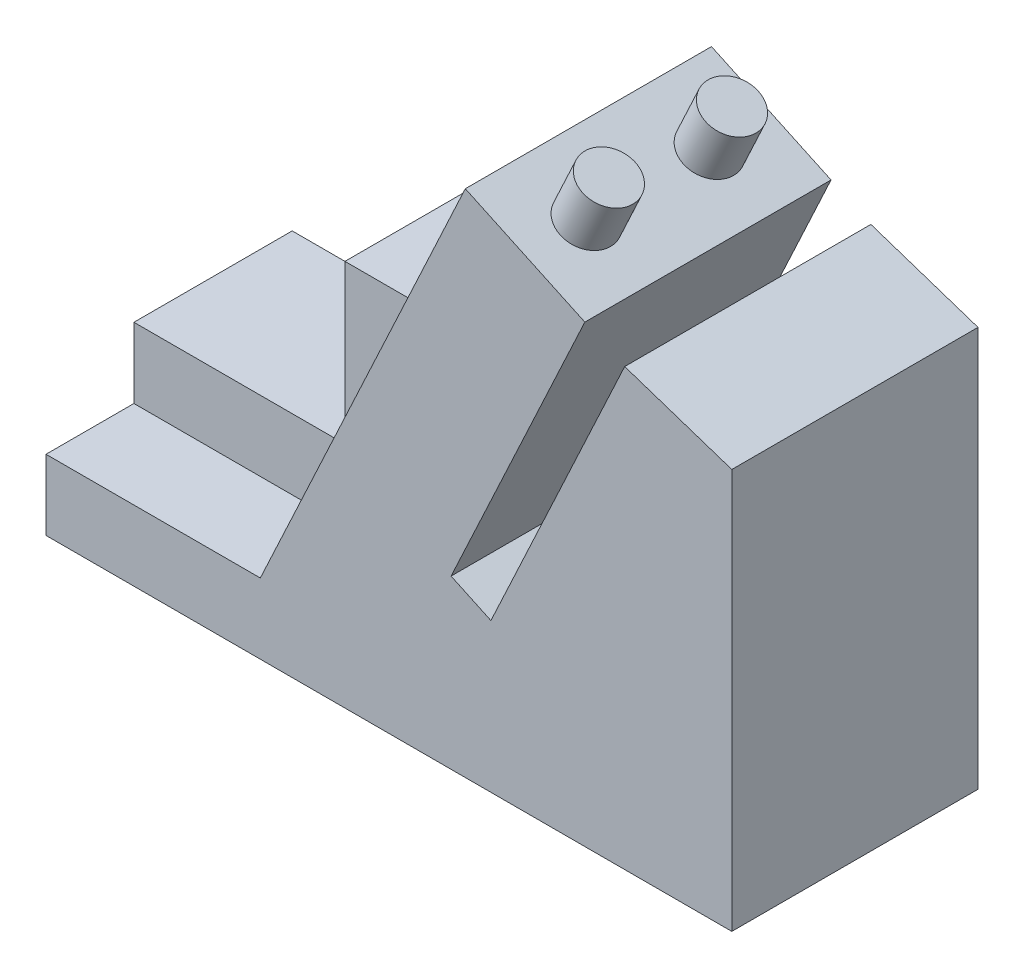
ISO-10303-21;
HEADER;
FILE_DESCRIPTION(('STEP AP214'),'2;1');
FILE_NAME('part.step','',(''),(''),'','','');
FILE_SCHEMA(('AUTOMOTIVE_DESIGN { 1 0 10303 214 1 1 1 1 }'));
ENDSEC;
DATA;
#1=APPLICATION_CONTEXT('core data for automotive mechanical design processes');
#2=APPLICATION_PROTOCOL_DEFINITION('international standard','automotive_design',2000,#1);
#3=PRODUCT_CONTEXT('',#1,'mechanical');
#4=PRODUCT('Part','Part','',(#3));
#5=PRODUCT_RELATED_PRODUCT_CATEGORY('part','',(#4));
#6=PRODUCT_DEFINITION_FORMATION('','',#4);
#7=PRODUCT_DEFINITION_CONTEXT('part definition',#1,'design');
#8=PRODUCT_DEFINITION('design','',#6,#7);
#9=PRODUCT_DEFINITION_SHAPE('','',#8);
#10=(LENGTH_UNIT() NAMED_UNIT(*) SI_UNIT(.MILLI.,.METRE.));
#11=(NAMED_UNIT(*) PLANE_ANGLE_UNIT() SI_UNIT($,.RADIAN.));
#12=(NAMED_UNIT(*) SI_UNIT($,.STERADIAN.) SOLID_ANGLE_UNIT());
#13=UNCERTAINTY_MEASURE_WITH_UNIT(LENGTH_MEASURE(1.E-05),#10,'distance_accuracy_value','');
#14=(GEOMETRIC_REPRESENTATION_CONTEXT(3) GLOBAL_UNCERTAINTY_ASSIGNED_CONTEXT((#13)) GLOBAL_UNIT_ASSIGNED_CONTEXT((#10,
#11,#12)) REPRESENTATION_CONTEXT('',''));
#15=CARTESIAN_POINT('',(0.,0.,0.));
#16=DIRECTION('',(0.,0.,1.));
#17=DIRECTION('',(1.,0.,0.));
#18=AXIS2_PLACEMENT_3D('',#15,#16,#17);
#19=CARTESIAN_POINT('',(0.,0.,28.));
#20=DIRECTION('',(-1.,0.,0.));
#21=DIRECTION('',(0.,0.,1.));
#22=AXIS2_PLACEMENT_3D('',#19,#20,#21);
#23=PLANE('',#22);
#24=DIRECTION('',(0.,1.,0.));
#25=VECTOR('',#24,1.);
#26=CARTESIAN_POINT('',(0.,0.,0.));
#27=LINE('',#26,#25);
#28=CARTESIAN_POINT('',(0.,0.,0.));
#29=VERTEX_POINT('',#28);
#30=CARTESIAN_POINT('',(0.,45.5,0.));
#31=VERTEX_POINT('',#30);
#32=EDGE_CURVE('E164',#29,#31,#27,.T.);
#33=ORIENTED_EDGE('',*,*,#32,.T.);
#34=DIRECTION('',(0.,0.,-1.));
#35=VECTOR('',#34,1.);
#36=CARTESIAN_POINT('',(0.,45.5,28.));
#37=LINE('',#36,#35);
#38=CARTESIAN_POINT('',(0.,45.5,28.));
#39=VERTEX_POINT('',#38);
#40=EDGE_CURVE('E11',#39,#31,#37,.T.);
#41=ORIENTED_EDGE('',*,*,#40,.F.);
#42=DIRECTION('',(0.,1.,0.));
#43=VECTOR('',#42,1.);
#44=CARTESIAN_POINT('',(0.,0.,28.));
#45=LINE('',#44,#43);
#46=CARTESIAN_POINT('',(0.,0.,28.));
#47=VERTEX_POINT('',#46);
#48=EDGE_CURVE('E199',#47,#39,#45,.T.);
#49=ORIENTED_EDGE('',*,*,#48,.F.);
#50=DIRECTION('',(0.,0.,-1.));
#51=VECTOR('',#50,1.);
#52=CARTESIAN_POINT('',(0.,0.,28.));
#53=LINE('',#52,#51);
#54=EDGE_CURVE('E65',#47,#29,#53,.T.);
#55=ORIENTED_EDGE('',*,*,#54,.T.);
#56=EDGE_LOOP('',(#33,#41,#49,#55));
#57=FACE_BOUND('',#56,.T.);
#58=ADVANCED_FACE('F41',(#57),#23,.F.);
#59=CARTESIAN_POINT('',(13.6139316460527,40.9769955049263,28.));
#60=DIRECTION('',(-0.315288268413878,-0.948995947199238,0.));
#61=DIRECTION('',(0.948995947199238,-0.315288268413878,0.));
#62=AXIS2_PLACEMENT_3D('',#59,#60,#61);
#63=PLANE('',#62);
#64=DIRECTION('',(-0.948995947199238,0.315288268413878,0.));
#65=VECTOR('',#64,1.);
#66=CARTESIAN_POINT('',(13.6139316460527,40.9769955049263,0.));
#67=LINE('',#66,#65);
#68=CARTESIAN_POINT('',(-12.1831015382463,49.5476347651859,0.));
#69=VERTEX_POINT('',#68);
#70=EDGE_CURVE('E167',#31,#69,#67,.T.);
#71=ORIENTED_EDGE('',*,*,#70,.T.);
#72=DIRECTION('',(0.,0.,-1.));
#73=VECTOR('',#72,1.);
#74=CARTESIAN_POINT('',(-12.1831015382463,49.5476347651859,28.));
#75=LINE('',#74,#73);
#76=CARTESIAN_POINT('',(-12.1831015382463,49.5476347651859,28.));
#77=VERTEX_POINT('',#76);
#78=EDGE_CURVE('E49',#77,#69,#75,.T.);
#79=ORIENTED_EDGE('',*,*,#78,.F.);
#80=DIRECTION('',(-0.948995947199238,0.315288268413878,0.));
#81=VECTOR('',#80,1.);
#82=CARTESIAN_POINT('',(13.6139316460527,40.9769955049263,28.));
#83=LINE('',#82,#81);
#84=EDGE_CURVE('E103',#39,#77,#83,.T.);
#85=ORIENTED_EDGE('',*,*,#84,.F.);
#86=ORIENTED_EDGE('',*,*,#40,.T.);
#87=EDGE_LOOP('',(#71,#79,#85,#86));
#88=FACE_BOUND('',#87,.T.);
#89=ADVANCED_FACE('F225',(#88),#63,.F.);
#90=CARTESIAN_POINT('',(-28.9849692680718,13.5159131410895,28.));
#91=DIRECTION('',(-0.906307787036647,0.422618261740707,0.));
#92=DIRECTION('',(-0.422618261740707,-0.906307787036647,0.));
#93=AXIS2_PLACEMENT_3D('',#90,#91,#92);
#94=PLANE('',#93);
#95=DIRECTION('',(0.422618261740706,0.906307787036647,0.));
#96=VECTOR('',#95,1.);
#97=CARTESIAN_POINT('',(-28.9849692680718,13.5159131410895,0.));
#98=LINE('',#97,#96);
#99=CARTESIAN_POINT('',(-27.3973589609117,16.9205544318666,0.));
#100=VERTEX_POINT('',#99);
#101=EDGE_CURVE('E172',#100,#69,#98,.T.);
#102=ORIENTED_EDGE('',*,*,#101,.F.);
#103=DIRECTION('',(0.,0.,-1.));
#104=VECTOR('',#103,1.);
#105=CARTESIAN_POINT('',(-27.3973589609117,16.9205544318666,28.));
#106=LINE('',#105,#104);
#107=CARTESIAN_POINT('',(-27.3973589609117,16.9205544318666,28.));
#108=VERTEX_POINT('',#107);
#109=EDGE_CURVE('E216',#108,#100,#106,.T.);
#110=ORIENTED_EDGE('',*,*,#109,.F.);
#111=DIRECTION('',(0.422618261740706,0.906307787036647,0.));
#112=VECTOR('',#111,1.);
#113=CARTESIAN_POINT('',(-28.9849692680718,13.5159131410895,28.));
#114=LINE('',#113,#112);
#115=EDGE_CURVE('E224',#108,#77,#114,.T.);
#116=ORIENTED_EDGE('',*,*,#115,.T.);
#117=ORIENTED_EDGE('',*,*,#78,.T.);
#118=EDGE_LOOP('',(#102,#110,#116,#117));
#119=FACE_BOUND('',#118,.T.);
#120=ADVANCED_FACE('F222',(#119),#94,.T.);
#121=CARTESIAN_POINT('',(1.58761030716014,3.40464129077717,28.));
#122=DIRECTION('',(0.422618261740705,0.906307787036647,0.));
#123=DIRECTION('',(-0.906307787036647,0.422618261740705,0.));
#124=AXIS2_PLACEMENT_3D('',#121,#122,#123);
#125=PLANE('',#124);
#126=DIRECTION('',(0.906307787036647,-0.422618261740705,0.));
#127=VECTOR('',#126,1.);
#128=CARTESIAN_POINT('',(1.58761030716014,3.40464129077717,0.));
#129=LINE('',#128,#127);
#130=CARTESIAN_POINT('',(-31.9288978960949,19.0336457405701,0.));
#131=VERTEX_POINT('',#130);
#132=EDGE_CURVE('E176',#131,#100,#129,.T.);
#133=ORIENTED_EDGE('',*,*,#132,.F.);
#134=DIRECTION('',(0.,0.,-1.));
#135=VECTOR('',#134,1.);
#136=CARTESIAN_POINT('',(-31.9288978960949,19.0336457405701,28.));
#137=LINE('',#136,#135);
#138=CARTESIAN_POINT('',(-31.9288978960949,19.0336457405701,28.));
#139=VERTEX_POINT('',#138);
#140=EDGE_CURVE('E213',#139,#131,#137,.T.);
#141=ORIENTED_EDGE('',*,*,#140,.F.);
#142=DIRECTION('',(0.906307787036647,-0.422618261740705,0.));
#143=VECTOR('',#142,1.);
#144=CARTESIAN_POINT('',(1.58761030716014,3.40464129077717,28.));
#145=LINE('',#144,#143);
#146=EDGE_CURVE('E234',#139,#108,#145,.T.);
#147=ORIENTED_EDGE('',*,*,#146,.T.);
#148=ORIENTED_EDGE('',*,*,#109,.T.);
#149=EDGE_LOOP('',(#133,#141,#147,#148));
#150=FACE_BOUND('',#149,.T.);
#151=ADVANCED_FACE('F231',(#150),#125,.T.);
#152=CARTESIAN_POINT('',(-33.5165082032551,15.629004449793,28.));
#153=DIRECTION('',(0.906307787036646,-0.422618261740707,0.));
#154=DIRECTION('',(0.422618261740707,0.906307787036646,0.));
#155=AXIS2_PLACEMENT_3D('',#152,#153,#154);
#156=PLANE('',#155);
#157=DIRECTION('',(-0.422618261740707,-0.906307787036646,0.));
#158=VECTOR('',#157,1.);
#159=CARTESIAN_POINT('',(-33.5165082032551,15.629004449793,0.));
#160=LINE('',#159,#158);
#161=CARTESIAN_POINT('',(-16.7146404734295,51.6607260738894,0.));
#162=VERTEX_POINT('',#161);
#163=EDGE_CURVE('E180',#162,#131,#160,.T.);
#164=ORIENTED_EDGE('',*,*,#163,.F.);
#165=DIRECTION('',(0.,0.,-1.));
#166=VECTOR('',#165,1.);
#167=CARTESIAN_POINT('',(-16.7146404734295,51.6607260738894,28.));
#168=LINE('',#167,#166);
#169=CARTESIAN_POINT('',(-16.7146404734295,51.6607260738894,28.));
#170=VERTEX_POINT('',#169);
#171=EDGE_CURVE('E210',#170,#162,#168,.T.);
#172=ORIENTED_EDGE('',*,*,#171,.F.);
#173=DIRECTION('',(-0.422618261740707,-0.906307787036646,0.));
#174=VECTOR('',#173,1.);
#175=CARTESIAN_POINT('',(-33.5165082032551,15.629004449793,28.));
#176=LINE('',#175,#174);
#177=EDGE_CURVE('E241',#170,#139,#176,.T.);
#178=ORIENTED_EDGE('',*,*,#177,.T.);
#179=ORIENTED_EDGE('',*,*,#140,.T.);
#180=EDGE_LOOP('',(#164,#172,#178,#179));
#181=FACE_BOUND('',#180,.T.);
#182=ADVANCED_FACE('F332',(#181),#156,.T.);
#183=CARTESIAN_POINT('',(16.8018677298256,36.0317216240964,28.));
#184=DIRECTION('',(0.422618261740707,0.906307787036646,0.));
#185=DIRECTION('',(-0.906307787036646,0.422618261740708,0.));
#186=AXIS2_PLACEMENT_3D('',#183,#184,#185);
#187=PLANE('',#186);
#188=CARTESIAN_POINT('',(-23.5119488762043,54.8303630369447,7.));
#189=DIRECTION('',(0.422618261740708,0.906307787036646,0.));
#190=DIRECTION('',(0.906307787036646,-0.422618261740708,0.));
#191=AXIS2_PLACEMENT_3D('',#188,#189,#190);
#192=CIRCLE('',#191,3.);
#193=CARTESIAN_POINT('',(-20.7930255150944,53.5625082517226,7.));
#194=VERTEX_POINT('',#193);
#195=EDGE_CURVE('E454',#194,#194,#192,.T.);
#196=ORIENTED_EDGE('',*,*,#195,.F.);
#197=EDGE_LOOP('',(#196));
#198=FACE_BOUND('',#197,.T.);
#199=CARTESIAN_POINT('',(-23.5119488762043,54.8303630369447,21.));
#200=DIRECTION('',(0.422618261740708,0.906307787036646,0.));
#201=DIRECTION('',(-0.906307787036646,0.422618261740708,0.));
#202=AXIS2_PLACEMENT_3D('',#199,#200,#201);
#203=CIRCLE('',#202,3.);
#204=CARTESIAN_POINT('',(-20.7930255150944,53.5625082517226,21.));
#205=VERTEX_POINT('',#204);
#206=EDGE_CURVE('E453',#205,#205,#203,.T.);
#207=ORIENTED_EDGE('',*,*,#206,.F.);
#208=EDGE_LOOP('',(#207));
#209=FACE_BOUND('',#208,.T.);
#210=DIRECTION('',(0.906307787036646,-0.422618261740707,0.));
#211=VECTOR('',#210,1.);
#212=CARTESIAN_POINT('',(16.8018677298256,36.0317216240964,0.));
#213=LINE('',#212,#211);
#214=CARTESIAN_POINT('',(-30.3092572789792,58.,0.));
#215=VERTEX_POINT('',#214);
#216=EDGE_CURVE('E184',#215,#162,#213,.T.);
#217=ORIENTED_EDGE('',*,*,#216,.F.);
#218=DIRECTION('',(0.,0.,-1.));
#219=VECTOR('',#218,1.);
#220=CARTESIAN_POINT('',(-30.3092572789792,58.,28.));
#221=LINE('',#220,#219);
#222=CARTESIAN_POINT('',(-30.3092572789792,58.,28.));
#223=VERTEX_POINT('',#222);
#224=EDGE_CURVE('E206',#223,#215,#221,.T.);
#225=ORIENTED_EDGE('',*,*,#224,.F.);
#226=DIRECTION('',(0.906307787036646,-0.422618261740707,0.));
#227=VECTOR('',#226,1.);
#228=CARTESIAN_POINT('',(16.8018677298256,36.0317216240964,28.));
#229=LINE('',#228,#227);
#230=EDGE_CURVE('E248',#223,#170,#229,.T.);
#231=ORIENTED_EDGE('',*,*,#230,.T.);
#232=ORIENTED_EDGE('',*,*,#171,.T.);
#233=EDGE_LOOP('',(#217,#225,#231,#232));
#234=FACE_BOUND('',#233,.T.);
#235=ADVANCED_FACE('F335',(#198,#209,#234),#187,.T.);
#236=CARTESIAN_POINT('',(-47.1111250088047,21.9682783759034,28.));
#237=DIRECTION('',(-0.906307787036648,0.422618261740704,0.));
#238=DIRECTION('',(-0.422618261740704,-0.906307787036648,0.));
#239=AXIS2_PLACEMENT_3D('',#236,#237,#238);
#240=PLANE('',#239);
#241=DIRECTION('',(0.,0.,-1.));
#242=VECTOR('',#241,1.);
#243=CARTESIAN_POINT('',(-41.5006410746993,34.,18.));
#244=LINE('',#243,#242);
#245=CARTESIAN_POINT('',(-41.5006410746993,34.,18.));
#246=VERTEX_POINT('',#245);
#247=CARTESIAN_POINT('',(-41.5006410746993,34.,0.));
#248=VERTEX_POINT('',#247);
#249=EDGE_CURVE('E168',#246,#248,#244,.T.);
#250=ORIENTED_EDGE('',*,*,#249,.F.);
#251=DIRECTION('',(0.422618261740704,0.906307787036648,0.));
#252=VECTOR('',#251,1.);
#253=CARTESIAN_POINT('',(-47.1111250088047,21.9682783759034,18.));
#254=LINE('',#253,#252);
#255=CARTESIAN_POINT('',(-53.6246401867294,7.99999999999999,18.));
#256=VERTEX_POINT('',#255);
#257=EDGE_CURVE('E260',#256,#246,#254,.T.);
#258=ORIENTED_EDGE('',*,*,#257,.F.);
#259=DIRECTION('',(0.,0.,-1.));
#260=VECTOR('',#259,1.);
#261=CARTESIAN_POINT('',(-53.6246401867294,7.99999999999999,28.));
#262=LINE('',#261,#260);
#263=CARTESIAN_POINT('',(-53.6246401867294,7.99999999999999,28.));
#264=VERTEX_POINT('',#263);
#265=EDGE_CURVE('E141',#264,#256,#262,.T.);
#266=ORIENTED_EDGE('',*,*,#265,.F.);
#267=DIRECTION('',(0.422618261740704,0.906307787036648,0.));
#268=VECTOR('',#267,1.);
#269=CARTESIAN_POINT('',(-47.1111250088047,21.9682783759034,28.));
#270=LINE('',#269,#268);
#271=EDGE_CURVE('E152',#264,#223,#270,.T.);
#272=ORIENTED_EDGE('',*,*,#271,.T.);
#273=ORIENTED_EDGE('',*,*,#224,.T.);
#274=DIRECTION('',(0.422618261740704,0.906307787036648,0.));
#275=VECTOR('',#274,1.);
#276=CARTESIAN_POINT('',(-47.1111250088047,21.9682783759034,0.));
#277=LINE('',#276,#275);
#278=EDGE_CURVE('E188',#248,#215,#277,.T.);
#279=ORIENTED_EDGE('',*,*,#278,.F.);
#280=EDGE_LOOP('',(#250,#258,#266,#272,#273,#279));
#281=FACE_BOUND('',#280,.T.);
#282=ADVANCED_FACE('F254',(#281),#240,.T.);
#283=CARTESIAN_POINT('',(0.,7.99999999999999,28.));
#284=DIRECTION('',(0.,1.,0.));
#285=DIRECTION('',(0.,0.,1.));
#286=AXIS2_PLACEMENT_3D('',#283,#284,#285);
#287=PLANE('',#286);
#288=DIRECTION('',(1.,0.,0.));
#289=VECTOR('',#288,1.);
#290=CARTESIAN_POINT('',(0.,7.99999999999999,18.));
#291=LINE('',#290,#289);
#292=CARTESIAN_POINT('',(-78.,7.99999999999999,18.));
#293=VERTEX_POINT('',#292);
#294=EDGE_CURVE('E136',#293,#256,#291,.T.);
#295=ORIENTED_EDGE('',*,*,#294,.F.);
#296=DIRECTION('',(0.,0.,-1.));
#297=VECTOR('',#296,1.);
#298=CARTESIAN_POINT('',(-78.,7.99999999999999,28.));
#299=LINE('',#298,#297);
#300=CARTESIAN_POINT('',(-78.,7.99999999999999,28.));
#301=VERTEX_POINT('',#300);
#302=EDGE_CURVE('E129',#301,#293,#299,.T.);
#303=ORIENTED_EDGE('',*,*,#302,.F.);
#304=DIRECTION('',(1.,0.,0.));
#305=VECTOR('',#304,1.);
#306=CARTESIAN_POINT('',(0.,7.99999999999999,28.));
#307=LINE('',#306,#305);
#308=EDGE_CURVE('E133',#301,#264,#307,.T.);
#309=ORIENTED_EDGE('',*,*,#308,.T.);
#310=ORIENTED_EDGE('',*,*,#265,.T.);
#311=EDGE_LOOP('',(#295,#303,#309,#310));
#312=FACE_BOUND('',#311,.T.);
#313=ADVANCED_FACE('F131',(#312),#287,.T.);
#314=CARTESIAN_POINT('',(-78.,0.,28.));
#315=DIRECTION('',(-1.,0.,0.));
#316=DIRECTION('',(0.,-1.,0.));
#317=AXIS2_PLACEMENT_3D('',#314,#315,#316);
#318=PLANE('',#317);
#319=DIRECTION('',(0.,1.,0.));
#320=VECTOR('',#319,1.);
#321=CARTESIAN_POINT('',(-78.,0.,0.));
#322=LINE('',#321,#320);
#323=CARTESIAN_POINT('',(-78.,0.,0.));
#324=VERTEX_POINT('',#323);
#325=CARTESIAN_POINT('',(-78.,16.,0.));
#326=VERTEX_POINT('',#325);
#327=EDGE_CURVE('E191',#324,#326,#322,.T.);
#328=ORIENTED_EDGE('',*,*,#327,.F.);
#329=DIRECTION('',(0.,0.,-1.));
#330=VECTOR('',#329,1.);
#331=CARTESIAN_POINT('',(-78.,0.,28.));
#332=LINE('',#331,#330);
#333=CARTESIAN_POINT('',(-78.,0.,28.));
#334=VERTEX_POINT('',#333);
#335=EDGE_CURVE('E142',#334,#324,#332,.T.);
#336=ORIENTED_EDGE('',*,*,#335,.F.);
#337=DIRECTION('',(0.,1.,0.));
#338=VECTOR('',#337,1.);
#339=CARTESIAN_POINT('',(-78.,0.,28.));
#340=LINE('',#339,#338);
#341=EDGE_CURVE('E149',#334,#301,#340,.T.);
#342=ORIENTED_EDGE('',*,*,#341,.T.);
#343=ORIENTED_EDGE('',*,*,#302,.T.);
#344=DIRECTION('',(0.,1.,0.));
#345=VECTOR('',#344,1.);
#346=CARTESIAN_POINT('',(-78.,0.,18.));
#347=LINE('',#346,#345);
#348=CARTESIAN_POINT('',(-78.,16.,18.));
#349=VERTEX_POINT('',#348);
#350=EDGE_CURVE('E289',#293,#349,#347,.T.);
#351=ORIENTED_EDGE('',*,*,#350,.T.);
#352=DIRECTION('',(0.,0.,-1.));
#353=VECTOR('',#352,1.);
#354=CARTESIAN_POINT('',(-78.,16.,18.));
#355=LINE('',#354,#353);
#356=EDGE_CURVE('E288',#349,#326,#355,.T.);
#357=ORIENTED_EDGE('',*,*,#356,.T.);
#358=EDGE_LOOP('',(#328,#336,#342,#343,#351,#357));
#359=FACE_BOUND('',#358,.T.);
#360=ADVANCED_FACE('F156',(#359),#318,.T.);
#361=CARTESIAN_POINT('',(0.,0.,28.));
#362=DIRECTION('',(0.,-1.,0.));
#363=DIRECTION('',(1.,0.,0.));
#364=AXIS2_PLACEMENT_3D('',#361,#362,#363);
#365=PLANE('',#364);
#366=DIRECTION('',(-1.,0.,0.));
#367=VECTOR('',#366,1.);
#368=CARTESIAN_POINT('',(0.,0.,0.));
#369=LINE('',#368,#367);
#370=EDGE_CURVE('E195',#29,#324,#369,.T.);
#371=ORIENTED_EDGE('',*,*,#370,.F.);
#372=ORIENTED_EDGE('',*,*,#54,.F.);
#373=DIRECTION('',(-1.,0.,0.));
#374=VECTOR('',#373,1.);
#375=CARTESIAN_POINT('',(0.,0.,28.));
#376=LINE('',#375,#374);
#377=EDGE_CURVE('E158',#47,#334,#376,.T.);
#378=ORIENTED_EDGE('',*,*,#377,.T.);
#379=ORIENTED_EDGE('',*,*,#335,.T.);
#380=EDGE_LOOP('',(#371,#372,#378,#379));
#381=FACE_BOUND('',#380,.T.);
#382=ADVANCED_FACE('F311',(#381),#365,.T.);
#383=CARTESIAN_POINT('',(0.,0.,28.));
#384=DIRECTION('',(0.,0.,1.));
#385=DIRECTION('',(1.,0.,0.));
#386=AXIS2_PLACEMENT_3D('',#383,#384,#385);
#387=PLANE('',#386);
#388=ORIENTED_EDGE('',*,*,#48,.T.);
#389=ORIENTED_EDGE('',*,*,#84,.T.);
#390=ORIENTED_EDGE('',*,*,#115,.F.);
#391=ORIENTED_EDGE('',*,*,#146,.F.);
#392=ORIENTED_EDGE('',*,*,#177,.F.);
#393=ORIENTED_EDGE('',*,*,#230,.F.);
#394=ORIENTED_EDGE('',*,*,#271,.F.);
#395=ORIENTED_EDGE('',*,*,#308,.F.);
#396=ORIENTED_EDGE('',*,*,#341,.F.);
#397=ORIENTED_EDGE('',*,*,#377,.F.);
#398=EDGE_LOOP('',(#388,#389,#390,#391,#392,#393,#394,#395,#396,#397));
#399=FACE_BOUND('',#398,.T.);
#400=ADVANCED_FACE('F147',(#399),#387,.T.);
#401=CARTESIAN_POINT('',(0.,0.,0.));
#402=DIRECTION('',(0.,0.,1.));
#403=DIRECTION('',(1.,0.,0.));
#404=AXIS2_PLACEMENT_3D('',#401,#402,#403);
#405=PLANE('',#404);
#406=ORIENTED_EDGE('',*,*,#32,.F.);
#407=ORIENTED_EDGE('',*,*,#370,.T.);
#408=ORIENTED_EDGE('',*,*,#327,.T.);
#409=DIRECTION('',(1.,0.,0.));
#410=VECTOR('',#409,1.);
#411=CARTESIAN_POINT('',(0.,16.,0.));
#412=LINE('',#411,#410);
#413=CARTESIAN_POINT('',(-54.,16.,0.));
#414=VERTEX_POINT('',#413);
#415=EDGE_CURVE('E287',#326,#414,#412,.T.);
#416=ORIENTED_EDGE('',*,*,#415,.T.);
#417=DIRECTION('',(0.,1.,0.));
#418=VECTOR('',#417,1.);
#419=CARTESIAN_POINT('',(-54.,0.,0.));
#420=LINE('',#419,#418);
#421=CARTESIAN_POINT('',(-54.,34.,0.));
#422=VERTEX_POINT('',#421);
#423=EDGE_CURVE('E296',#414,#422,#420,.T.);
#424=ORIENTED_EDGE('',*,*,#423,.T.);
#425=DIRECTION('',(1.,0.,0.));
#426=VECTOR('',#425,1.);
#427=CARTESIAN_POINT('',(0.,34.,0.));
#428=LINE('',#427,#426);
#429=EDGE_CURVE('E56',#422,#248,#428,.T.);
#430=ORIENTED_EDGE('',*,*,#429,.T.);
#431=ORIENTED_EDGE('',*,*,#278,.T.);
#432=ORIENTED_EDGE('',*,*,#216,.T.);
#433=ORIENTED_EDGE('',*,*,#163,.T.);
#434=ORIENTED_EDGE('',*,*,#132,.T.);
#435=ORIENTED_EDGE('',*,*,#101,.T.);
#436=ORIENTED_EDGE('',*,*,#70,.F.);
#437=EDGE_LOOP('',(#406,#407,#408,#416,#424,#430,#431,#432,#433,#434,#435,#436));
#438=FACE_BOUND('',#437,.T.);
#439=ADVANCED_FACE('F227',(#438),#405,.F.);
#440=CARTESIAN_POINT('',(0.,34.,18.));
#441=DIRECTION('',(0.,1.,0.));
#442=DIRECTION('',(0.,0.,1.));
#443=AXIS2_PLACEMENT_3D('',#440,#441,#442);
#444=PLANE('',#443);
#445=ORIENTED_EDGE('',*,*,#429,.F.);
#446=DIRECTION('',(0.,0.,-1.));
#447=VECTOR('',#446,1.);
#448=CARTESIAN_POINT('',(-54.,34.,18.));
#449=LINE('',#448,#447);
#450=CARTESIAN_POINT('',(-54.,34.,18.));
#451=VERTEX_POINT('',#450);
#452=EDGE_CURVE('E306',#451,#422,#449,.T.);
#453=ORIENTED_EDGE('',*,*,#452,.F.);
#454=DIRECTION('',(1.,0.,0.));
#455=VECTOR('',#454,1.);
#456=CARTESIAN_POINT('',(0.,34.,18.));
#457=LINE('',#456,#455);
#458=EDGE_CURVE('E471',#451,#246,#457,.T.);
#459=ORIENTED_EDGE('',*,*,#458,.T.);
#460=ORIENTED_EDGE('',*,*,#249,.T.);
#461=EDGE_LOOP('',(#445,#453,#459,#460));
#462=FACE_BOUND('',#461,.T.);
#463=ADVANCED_FACE('F362',(#462),#444,.T.);
#464=CARTESIAN_POINT('',(-54.,0.,18.));
#465=DIRECTION('',(-1.,0.,0.));
#466=DIRECTION('',(0.,0.,1.));
#467=AXIS2_PLACEMENT_3D('',#464,#465,#466);
#468=PLANE('',#467);
#469=ORIENTED_EDGE('',*,*,#423,.F.);
#470=DIRECTION('',(0.,0.,-1.));
#471=VECTOR('',#470,1.);
#472=CARTESIAN_POINT('',(-54.,16.,18.));
#473=LINE('',#472,#471);
#474=CARTESIAN_POINT('',(-54.,16.,18.));
#475=VERTEX_POINT('',#474);
#476=EDGE_CURVE('E283',#475,#414,#473,.T.);
#477=ORIENTED_EDGE('',*,*,#476,.F.);
#478=DIRECTION('',(0.,1.,0.));
#479=VECTOR('',#478,1.);
#480=CARTESIAN_POINT('',(-54.,0.,18.));
#481=LINE('',#480,#479);
#482=EDGE_CURVE('E475',#475,#451,#481,.T.);
#483=ORIENTED_EDGE('',*,*,#482,.T.);
#484=ORIENTED_EDGE('',*,*,#452,.T.);
#485=EDGE_LOOP('',(#469,#477,#483,#484));
#486=FACE_BOUND('',#485,.T.);
#487=ADVANCED_FACE('F370',(#486),#468,.T.);
#488=CARTESIAN_POINT('',(0.,16.,18.));
#489=DIRECTION('',(0.,1.,0.));
#490=DIRECTION('',(0.,0.,1.));
#491=AXIS2_PLACEMENT_3D('',#488,#489,#490);
#492=PLANE('',#491);
#493=ORIENTED_EDGE('',*,*,#415,.F.);
#494=ORIENTED_EDGE('',*,*,#356,.F.);
#495=DIRECTION('',(1.,0.,0.));
#496=VECTOR('',#495,1.);
#497=CARTESIAN_POINT('',(0.,16.,18.));
#498=LINE('',#497,#496);
#499=EDGE_CURVE('E292',#349,#475,#498,.T.);
#500=ORIENTED_EDGE('',*,*,#499,.T.);
#501=ORIENTED_EDGE('',*,*,#476,.T.);
#502=EDGE_LOOP('',(#493,#494,#500,#501));
#503=FACE_BOUND('',#502,.T.);
#504=ADVANCED_FACE('F294',(#503),#492,.T.);
#505=CARTESIAN_POINT('',(0.,0.,18.));
#506=DIRECTION('',(0.,0.,1.));
#507=DIRECTION('',(1.,0.,0.));
#508=AXIS2_PLACEMENT_3D('',#505,#506,#507);
#509=PLANE('',#508);
#510=ORIENTED_EDGE('',*,*,#350,.F.);
#511=ORIENTED_EDGE('',*,*,#294,.T.);
#512=ORIENTED_EDGE('',*,*,#257,.T.);
#513=ORIENTED_EDGE('',*,*,#458,.F.);
#514=ORIENTED_EDGE('',*,*,#482,.F.);
#515=ORIENTED_EDGE('',*,*,#499,.F.);
#516=EDGE_LOOP('',(#510,#511,#512,#513,#514,#515));
#517=FACE_BOUND('',#516,.T.);
#518=ADVANCED_FACE('F389',(#517),#509,.T.);
#519=CARTESIAN_POINT('',(-20.9762393057601,60.2682097591646,21.));
#520=DIRECTION('',(-0.422618261740708,-0.906307787036646,0.));
#521=DIRECTION('',(0.906307787036646,-0.422618261740708,0.));
#522=AXIS2_PLACEMENT_3D('',#519,#520,#521);
#523=CYLINDRICAL_SURFACE('',#522,3.);
#524=CARTESIAN_POINT('',(-20.9762393057601,60.2682097591646,21.));
#525=DIRECTION('',(0.422618261740708,0.906307787036646,0.));
#526=DIRECTION('',(-0.906307787036646,0.422618261740708,0.));
#527=AXIS2_PLACEMENT_3D('',#524,#525,#526);
#528=CIRCLE('',#527,3.);
#529=CARTESIAN_POINT('',(-18.2573159446501,59.0003549739425,21.));
#530=VERTEX_POINT('',#529);
#531=EDGE_CURVE('E459',#530,#530,#528,.T.);
#532=CARTESIAN_POINT('',(-18.2573159446501,59.0003549739425,21.));
#533=CARTESIAN_POINT('',(-18.2837295860089,58.9437107372527,21.));
#534=CARTESIAN_POINT('',(-18.3101432273677,58.8870665005629,21.));
#535=CARTESIAN_POINT('',(-18.3629705100853,58.7737780271833,21.));
#536=CARTESIAN_POINT('',(-18.3893841514441,58.7171337904935,21.));
#537=CARTESIAN_POINT('',(-18.4422114341617,58.6038453171139,21.));
#538=CARTESIAN_POINT('',(-18.4686250755205,58.5472010804241,21.));
#539=CARTESIAN_POINT('',(-18.5214523582381,58.4339126070446,21.));
#540=CARTESIAN_POINT('',(-18.5478659995969,58.3772683703548,21.));
#541=CARTESIAN_POINT('',(-18.6006932823145,58.2639798969752,21.));
#542=CARTESIAN_POINT('',(-18.6271069236733,58.2073356602854,21.));
#543=CARTESIAN_POINT('',(-18.6799342063909,58.0940471869058,21.));
#544=CARTESIAN_POINT('',(-18.7063478477497,58.037402950216,21.));
#545=CARTESIAN_POINT('',(-18.7591751304672,57.9241144768364,21.));
#546=CARTESIAN_POINT('',(-18.785588771826,57.8674702401467,21.));
#547=CARTESIAN_POINT('',(-18.8384160545436,57.7541817667671,21.));
#548=CARTESIAN_POINT('',(-18.8648296959024,57.6975375300773,21.));
#549=CARTESIAN_POINT('',(-18.91765697862,57.5842490566977,21.));
#550=CARTESIAN_POINT('',(-18.9440706199788,57.5276048200079,21.));
#551=CARTESIAN_POINT('',(-18.9968979026964,57.4143163466283,21.));
#552=CARTESIAN_POINT('',(-19.0233115440552,57.3576721099385,21.));
#553=CARTESIAN_POINT('',(-19.0761388267728,57.244383636559,21.));
#554=CARTESIAN_POINT('',(-19.1025524681316,57.1877393998692,21.));
#555=CARTESIAN_POINT('',(-19.1553797508492,57.0744509264896,21.));
#556=CARTESIAN_POINT('',(-19.1817933922079,57.0178066897998,21.));
#557=CARTESIAN_POINT('',(-19.2346206749255,56.9045182164202,21.));
#558=CARTESIAN_POINT('',(-19.2610343162843,56.8478739797304,21.));
#559=CARTESIAN_POINT('',(-19.3138615990019,56.7345855063508,21.));
#560=CARTESIAN_POINT('',(-19.3402752403607,56.6779412696611,21.));
#561=CARTESIAN_POINT('',(-19.3931025230783,56.5646527962815,21.));
#562=CARTESIAN_POINT('',(-19.4195161644371,56.5080085595917,21.));
#563=CARTESIAN_POINT('',(-19.4723434471547,56.3947200862121,21.));
#564=CARTESIAN_POINT('',(-19.4987570885135,56.3380758495223,21.));
#565=CARTESIAN_POINT('',(-19.5515843712311,56.2247873761427,21.));
#566=CARTESIAN_POINT('',(-19.5779980125899,56.1681431394529,21.));
#567=CARTESIAN_POINT('',(-19.6308252953074,56.0548546660734,21.));
#568=CARTESIAN_POINT('',(-19.6572389366662,55.9982104293836,21.));
#569=CARTESIAN_POINT('',(-19.7100662193838,55.884921956004,21.));
#570=CARTESIAN_POINT('',(-19.7364798607426,55.8282777193142,21.));
#571=CARTESIAN_POINT('',(-19.7893071434602,55.7149892459346,21.));
#572=CARTESIAN_POINT('',(-19.815720784819,55.6583450092448,21.));
#573=CARTESIAN_POINT('',(-19.8685480675366,55.5450565358652,21.));
#574=CARTESIAN_POINT('',(-19.8949617088954,55.4884122991755,21.));
#575=CARTESIAN_POINT('',(-19.947788991613,55.3751238257959,21.));
#576=CARTESIAN_POINT('',(-19.9742026329718,55.3184795891061,21.));
#577=CARTESIAN_POINT('',(-20.0270299156894,55.2051911157265,21.));
#578=CARTESIAN_POINT('',(-20.0534435570482,55.1485468790367,21.));
#579=CARTESIAN_POINT('',(-20.1062708397657,55.0352584056571,21.));
#580=CARTESIAN_POINT('',(-20.1326844811245,54.9786141689673,21.));
#581=CARTESIAN_POINT('',(-20.1855117638421,54.8653256955878,21.));
#582=CARTESIAN_POINT('',(-20.2119254052009,54.808681458898,21.));
#583=CARTESIAN_POINT('',(-20.2647526879185,54.6953929855184,21.));
#584=CARTESIAN_POINT('',(-20.2911663292773,54.6387487488286,21.));
#585=CARTESIAN_POINT('',(-20.3439936119949,54.525460275449,21.));
#586=CARTESIAN_POINT('',(-20.3704072533537,54.4688160387592,21.));
#587=CARTESIAN_POINT('',(-20.4232345360713,54.3555275653797,21.));
#588=CARTESIAN_POINT('',(-20.4496481774301,54.2988833286899,21.));
#589=CARTESIAN_POINT('',(-20.5024754601477,54.1855948553103,21.));
#590=CARTESIAN_POINT('',(-20.5288891015065,54.1289506186205,21.));
#591=CARTESIAN_POINT('',(-20.581716384224,54.0156621452409,21.));
#592=CARTESIAN_POINT('',(-20.6081300255828,53.9590179085511,21.));
#593=CARTESIAN_POINT('',(-20.6609573083004,53.8457294351715,21.));
#594=CARTESIAN_POINT('',(-20.6873709496592,53.7890851984817,21.));
#595=CARTESIAN_POINT('',(-20.7401982323768,53.6757967251022,21.));
#596=CARTESIAN_POINT('',(-20.7666118737356,53.6191524884124,21.));
#597=CARTESIAN_POINT('',(-20.7930255150944,53.5625082517226,21.));
#598=B_SPLINE_CURVE_WITH_KNOTS('',3,(#532,#533,#534,#535,#536,#537,#538,#539,#540,#541,#542,
#543,#544,#545,#546,#547,#548,#549,#550,#551,#552,#553,#554,#555,#556,#557,#558,#559,#560,#561,
#562,#563,#564,#565,#566,#567,#568,#569,#570,#571,#572,#573,#574,#575,#576,#577,#578,#579,#580,
#581,#582,#583,#584,#585,#586,#587,#588,#589,#590,#591,#592,#593,#594,#595,#596,#597),
.UNSPECIFIED.,.F.,.F.,(4,2,2,2,2,2,2,2,2,2,2,2,2,2,2,2,2,2,2,2,2,2,2,2,2,2,2,2,2,2,2,2,4),(0.,
0.187500000000004,0.375000000000002,0.5625,0.750000000000005,0.937500000000004,1.125,
1.31250000000001,1.5,1.6875,1.87500000000001,2.0625,2.25,2.4375,2.62500000000001,2.8125,3.,
3.18750000000001,3.375,3.5625,3.75000000000001,3.9375,4.125,4.31250000000001,4.50000000000001,
4.6875,4.87500000000001,5.06250000000001,5.25000000000001,5.43750000000001,5.62500000000001,
5.81250000000001,6.00000000000001),.UNSPECIFIED.);
#599=EDGE_CURVE('BSEAM398',#530,#205,#598,.T.);
#600=ORIENTED_EDGE('',*,*,#531,.F.);
#601=ORIENTED_EDGE('',*,*,#206,.T.);
#602=ORIENTED_EDGE('',*,*,#599,.T.);
#603=ORIENTED_EDGE('',*,*,#599,.F.);
#604=EDGE_LOOP('',(#600,#602,#601,#603));
#605=FACE_BOUND('',#604,.T.);
#606=ADVANCED_FACE('F398',(#605),#523,.T.);
#607=CARTESIAN_POINT('',(-20.9762393057601,60.2682097591646,21.));
#608=DIRECTION('',(0.422618261740708,0.906307787036646,0.));
#609=DIRECTION('',(-0.906307787036646,0.422618261740708,0.));
#610=AXIS2_PLACEMENT_3D('',#607,#608,#609);
#611=PLANE('',#610);
#612=ORIENTED_EDGE('',*,*,#531,.T.);
#613=EDGE_LOOP('',(#612));
#614=FACE_BOUND('',#613,.T.);
#615=ADVANCED_FACE('F415',(#614),#611,.T.);
#616=CARTESIAN_POINT('',(-20.9762393057601,60.2682097591646,7.));
#617=DIRECTION('',(-0.422618261740708,-0.906307787036646,0.));
#618=DIRECTION('',(0.906307787036646,-0.422618261740708,0.));
#619=AXIS2_PLACEMENT_3D('',#616,#617,#618);
#620=CYLINDRICAL_SURFACE('',#619,3.);
#621=CARTESIAN_POINT('',(-20.9762393057601,60.2682097591646,7.));
#622=DIRECTION('',(0.422618261740708,0.906307787036646,0.));
#623=DIRECTION('',(0.906307787036646,-0.422618261740708,0.));
#624=AXIS2_PLACEMENT_3D('',#621,#622,#623);
#625=CIRCLE('',#624,3.);
#626=CARTESIAN_POINT('',(-18.2573159446501,59.0003549739425,7.));
#627=VERTEX_POINT('',#626);
#628=EDGE_CURVE('E451',#627,#627,#625,.T.);
#629=CARTESIAN_POINT('',(-18.2573159446501,59.0003549739425,7.));
#630=CARTESIAN_POINT('',(-18.2837295860089,58.9437107372527,7.));
#631=CARTESIAN_POINT('',(-18.3101432273677,58.8870665005629,7.));
#632=CARTESIAN_POINT('',(-18.3629705100853,58.7737780271833,7.));
#633=CARTESIAN_POINT('',(-18.3893841514441,58.7171337904935,7.));
#634=CARTESIAN_POINT('',(-18.4422114341617,58.6038453171139,7.));
#635=CARTESIAN_POINT('',(-18.4686250755205,58.5472010804241,7.));
#636=CARTESIAN_POINT('',(-18.5214523582381,58.4339126070446,7.));
#637=CARTESIAN_POINT('',(-18.5478659995969,58.3772683703548,7.));
#638=CARTESIAN_POINT('',(-18.6006932823145,58.2639798969752,7.));
#639=CARTESIAN_POINT('',(-18.6271069236733,58.2073356602854,7.));
#640=CARTESIAN_POINT('',(-18.6799342063909,58.0940471869058,7.));
#641=CARTESIAN_POINT('',(-18.7063478477497,58.037402950216,7.));
#642=CARTESIAN_POINT('',(-18.7591751304672,57.9241144768364,7.));
#643=CARTESIAN_POINT('',(-18.785588771826,57.8674702401467,7.));
#644=CARTESIAN_POINT('',(-18.8384160545436,57.7541817667671,7.));
#645=CARTESIAN_POINT('',(-18.8648296959024,57.6975375300773,7.));
#646=CARTESIAN_POINT('',(-18.91765697862,57.5842490566977,7.));
#647=CARTESIAN_POINT('',(-18.9440706199788,57.5276048200079,7.));
#648=CARTESIAN_POINT('',(-18.9968979026964,57.4143163466283,7.));
#649=CARTESIAN_POINT('',(-19.0233115440552,57.3576721099385,7.));
#650=CARTESIAN_POINT('',(-19.0761388267728,57.244383636559,7.));
#651=CARTESIAN_POINT('',(-19.1025524681316,57.1877393998692,7.));
#652=CARTESIAN_POINT('',(-19.1553797508492,57.0744509264896,7.));
#653=CARTESIAN_POINT('',(-19.1817933922079,57.0178066897998,7.));
#654=CARTESIAN_POINT('',(-19.2346206749255,56.9045182164202,7.));
#655=CARTESIAN_POINT('',(-19.2610343162843,56.8478739797304,7.));
#656=CARTESIAN_POINT('',(-19.3138615990019,56.7345855063508,7.));
#657=CARTESIAN_POINT('',(-19.3402752403607,56.6779412696611,7.));
#658=CARTESIAN_POINT('',(-19.3931025230783,56.5646527962815,7.));
#659=CARTESIAN_POINT('',(-19.4195161644371,56.5080085595917,7.));
#660=CARTESIAN_POINT('',(-19.4723434471547,56.3947200862121,7.));
#661=CARTESIAN_POINT('',(-19.4987570885135,56.3380758495223,7.));
#662=CARTESIAN_POINT('',(-19.5515843712311,56.2247873761427,7.));
#663=CARTESIAN_POINT('',(-19.5779980125899,56.1681431394529,7.));
#664=CARTESIAN_POINT('',(-19.6308252953074,56.0548546660734,7.));
#665=CARTESIAN_POINT('',(-19.6572389366662,55.9982104293836,7.));
#666=CARTESIAN_POINT('',(-19.7100662193838,55.884921956004,7.));
#667=CARTESIAN_POINT('',(-19.7364798607426,55.8282777193142,7.));
#668=CARTESIAN_POINT('',(-19.7893071434602,55.7149892459346,7.));
#669=CARTESIAN_POINT('',(-19.815720784819,55.6583450092448,7.));
#670=CARTESIAN_POINT('',(-19.8685480675366,55.5450565358652,7.));
#671=CARTESIAN_POINT('',(-19.8949617088954,55.4884122991755,7.));
#672=CARTESIAN_POINT('',(-19.947788991613,55.3751238257959,7.));
#673=CARTESIAN_POINT('',(-19.9742026329718,55.3184795891061,7.));
#674=CARTESIAN_POINT('',(-20.0270299156894,55.2051911157265,7.));
#675=CARTESIAN_POINT('',(-20.0534435570482,55.1485468790367,7.));
#676=CARTESIAN_POINT('',(-20.1062708397657,55.0352584056571,7.));
#677=CARTESIAN_POINT('',(-20.1326844811245,54.9786141689673,7.));
#678=CARTESIAN_POINT('',(-20.1855117638421,54.8653256955878,7.));
#679=CARTESIAN_POINT('',(-20.2119254052009,54.808681458898,7.));
#680=CARTESIAN_POINT('',(-20.2647526879185,54.6953929855184,7.));
#681=CARTESIAN_POINT('',(-20.2911663292773,54.6387487488286,7.));
#682=CARTESIAN_POINT('',(-20.3439936119949,54.525460275449,7.));
#683=CARTESIAN_POINT('',(-20.3704072533537,54.4688160387592,7.));
#684=CARTESIAN_POINT('',(-20.4232345360713,54.3555275653797,7.));
#685=CARTESIAN_POINT('',(-20.4496481774301,54.2988833286899,7.));
#686=CARTESIAN_POINT('',(-20.5024754601477,54.1855948553103,7.));
#687=CARTESIAN_POINT('',(-20.5288891015065,54.1289506186205,7.));
#688=CARTESIAN_POINT('',(-20.581716384224,54.0156621452409,7.));
#689=CARTESIAN_POINT('',(-20.6081300255828,53.9590179085511,7.));
#690=CARTESIAN_POINT('',(-20.6609573083004,53.8457294351715,7.));
#691=CARTESIAN_POINT('',(-20.6873709496592,53.7890851984817,7.));
#692=CARTESIAN_POINT('',(-20.7401982323768,53.6757967251022,7.));
#693=CARTESIAN_POINT('',(-20.7666118737356,53.6191524884124,7.));
#694=CARTESIAN_POINT('',(-20.7930255150944,53.5625082517226,7.));
#695=B_SPLINE_CURVE_WITH_KNOTS('',3,(#629,#630,#631,#632,#633,#634,#635,#636,#637,#638,#639,
#640,#641,#642,#643,#644,#645,#646,#647,#648,#649,#650,#651,#652,#653,#654,#655,#656,#657,#658,
#659,#660,#661,#662,#663,#664,#665,#666,#667,#668,#669,#670,#671,#672,#673,#674,#675,#676,#677,
#678,#679,#680,#681,#682,#683,#684,#685,#686,#687,#688,#689,#690,#691,#692,#693,#694),
.UNSPECIFIED.,.F.,.F.,(4,2,2,2,2,2,2,2,2,2,2,2,2,2,2,2,2,2,2,2,2,2,2,2,2,2,2,2,2,2,2,2,4),(0.,
0.187500000000004,0.375000000000002,0.5625,0.750000000000005,0.937500000000004,1.125,
1.31250000000001,1.5,1.6875,1.87500000000001,2.0625,2.25,2.4375,2.62500000000001,2.8125,3.,
3.18750000000001,3.375,3.5625,3.75000000000001,3.9375,4.125,4.31250000000001,4.50000000000001,
4.6875,4.87500000000001,5.06250000000001,5.25000000000001,5.43750000000001,5.62500000000001,
5.81250000000001,6.00000000000001),.UNSPECIFIED.);
#696=EDGE_CURVE('BSEAM425',#627,#194,#695,.T.);
#697=ORIENTED_EDGE('',*,*,#628,.F.);
#698=ORIENTED_EDGE('',*,*,#195,.T.);
#699=ORIENTED_EDGE('',*,*,#696,.T.);
#700=ORIENTED_EDGE('',*,*,#696,.F.);
#701=EDGE_LOOP('',(#697,#699,#698,#700));
#702=FACE_BOUND('',#701,.T.);
#703=ADVANCED_FACE('F425',(#702),#620,.T.);
#704=CARTESIAN_POINT('',(-20.9762393057601,60.2682097591646,7.));
#705=DIRECTION('',(-0.422618261740708,-0.906307787036646,0.));
#706=DIRECTION('',(0.906307787036646,-0.422618261740708,0.));
#707=AXIS2_PLACEMENT_3D('',#704,#705,#706);
#708=PLANE('',#707);
#709=ORIENTED_EDGE('',*,*,#628,.T.);
#710=EDGE_LOOP('',(#709));
#711=FACE_BOUND('',#710,.T.);
#712=ADVANCED_FACE('F435',(#711),#708,.F.);
#713=CLOSED_SHELL('',(#58,#89,#120,#151,#182,#235,#282,#313,#360,#382,#400,#439,#463,#487,#504,
#518,#606,#615,#703,#712));
#714=MANIFOLD_SOLID_BREP('B2',#713);
#715=ADVANCED_BREP_SHAPE_REPRESENTATION('',(#18,#714),#14);
#716=SHAPE_DEFINITION_REPRESENTATION(#9,#715);
ENDSEC;
END-ISO-10303-21;
